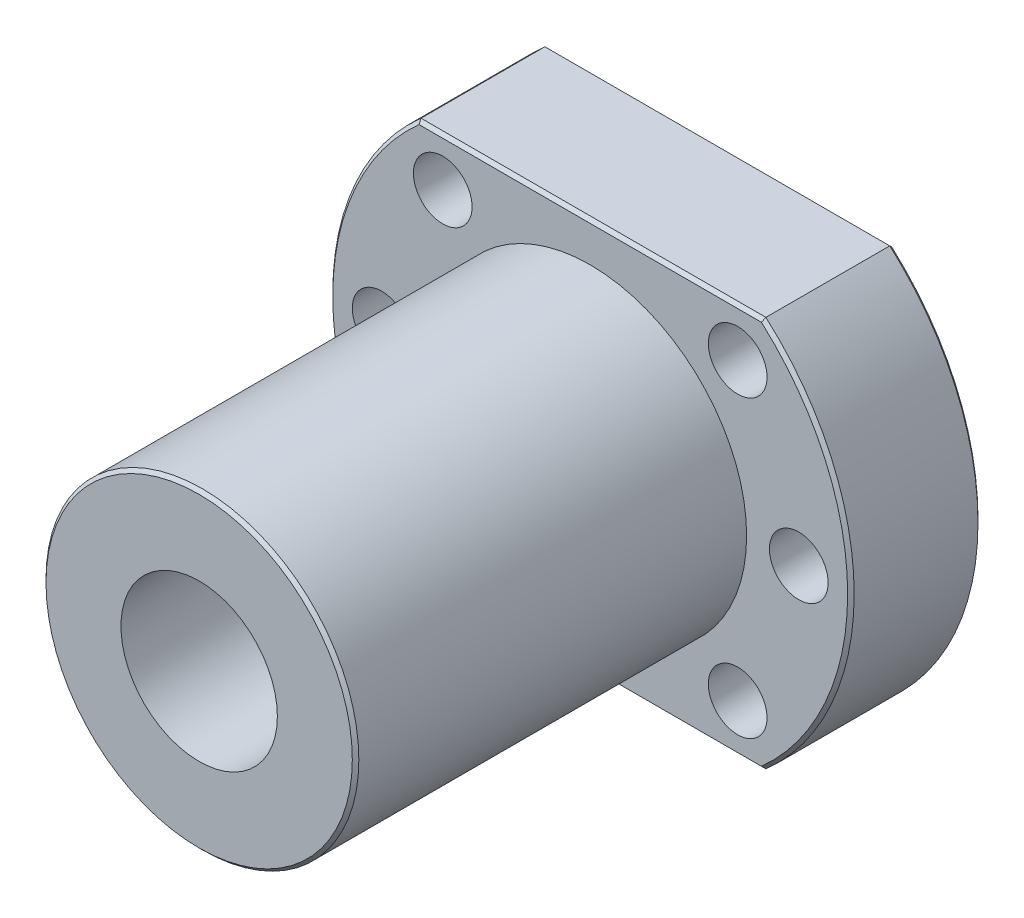
ISO-10303-21;
HEADER;
FILE_DESCRIPTION(('STEP AP214'),'2;1');
FILE_NAME('part.step','',(''),(''),'','','');
FILE_SCHEMA(('AUTOMOTIVE_DESIGN { 1 0 10303 214 1 1 1 1 }'));
ENDSEC;
DATA;
#1=APPLICATION_CONTEXT('core data for automotive mechanical design processes');
#2=APPLICATION_PROTOCOL_DEFINITION('international standard','automotive_design',2000,#1);
#3=PRODUCT_CONTEXT('',#1,'mechanical');
#4=PRODUCT('Part','Part','',(#3));
#5=PRODUCT_RELATED_PRODUCT_CATEGORY('part','',(#4));
#6=PRODUCT_DEFINITION_FORMATION('','',#4);
#7=PRODUCT_DEFINITION_CONTEXT('part definition',#1,'design');
#8=PRODUCT_DEFINITION('design','',#6,#7);
#9=PRODUCT_DEFINITION_SHAPE('','',#8);
#10=(LENGTH_UNIT() NAMED_UNIT(*) SI_UNIT(.MILLI.,.METRE.));
#11=(NAMED_UNIT(*) PLANE_ANGLE_UNIT() SI_UNIT($,.RADIAN.));
#12=(NAMED_UNIT(*) SI_UNIT($,.STERADIAN.) SOLID_ANGLE_UNIT());
#13=UNCERTAINTY_MEASURE_WITH_UNIT(LENGTH_MEASURE(1.E-05),#10,'distance_accuracy_value','');
#14=(GEOMETRIC_REPRESENTATION_CONTEXT(3) GLOBAL_UNCERTAINTY_ASSIGNED_CONTEXT((#13)) GLOBAL_UNIT_ASSIGNED_CONTEXT((#10,
#11,#12)) REPRESENTATION_CONTEXT('',''));
#15=CARTESIAN_POINT('',(0.,0.,0.));
#16=DIRECTION('',(0.,0.,1.));
#17=DIRECTION('',(1.,0.,0.));
#18=AXIS2_PLACEMENT_3D('',#15,#16,#17);
#19=CARTESIAN_POINT('',(16.,-1.1172740284298E-13,10.));
#20=DIRECTION('',(0.,0.,-1.));
#21=DIRECTION('',(-1.,0.,0.));
#22=AXIS2_PLACEMENT_3D('',#19,#20,#21);
#23=CYLINDRICAL_SURFACE('',#22,2.25);
#24=CARTESIAN_POINT('',(16.,-1.1172740284298E-13,10.));
#25=DIRECTION('',(0.,0.,1.));
#26=DIRECTION('',(1.,0.,0.));
#27=AXIS2_PLACEMENT_3D('',#24,#25,#26);
#28=CIRCLE('',#27,2.25);
#29=CARTESIAN_POINT('',(18.25,-1.1172740284298E-13,10.));
#30=VERTEX_POINT('',#29);
#31=EDGE_CURVE('E321',#30,#30,#28,.T.);
#32=ORIENTED_EDGE('',*,*,#31,.T.);
#33=EDGE_LOOP('',(#32));
#34=FACE_BOUND('',#33,.T.);
#35=CARTESIAN_POINT('',(16.,-1.1172740284298E-13,5.));
#36=DIRECTION('',(0.,0.,-1.));
#37=DIRECTION('',(-1.,0.,0.));
#38=AXIS2_PLACEMENT_3D('',#35,#36,#37);
#39=CIRCLE('',#38,2.25);
#40=CARTESIAN_POINT('',(13.75,-1.1172740284298E-13,5.));
#41=VERTEX_POINT('',#40);
#42=EDGE_CURVE('E41',#41,#41,#39,.T.);
#43=ORIENTED_EDGE('',*,*,#42,.T.);
#44=EDGE_LOOP('',(#43));
#45=FACE_BOUND('',#44,.T.);
#46=ADVANCED_FACE('F37',(#34,#45),#23,.F.);
#47=CARTESIAN_POINT('',(11.3137084989847,-11.3137084989849,10.));
#48=DIRECTION('',(0.,0.,-1.));
#49=DIRECTION('',(-1.,0.,0.));
#50=AXIS2_PLACEMENT_3D('',#47,#48,#49);
#51=CYLINDRICAL_SURFACE('',#50,2.25);
#52=CARTESIAN_POINT('',(11.3137084989847,-11.3137084989849,10.));
#53=DIRECTION('',(0.,0.,1.));
#54=DIRECTION('',(1.,0.,0.));
#55=AXIS2_PLACEMENT_3D('',#52,#53,#54);
#56=CIRCLE('',#55,2.25);
#57=CARTESIAN_POINT('',(13.5637084989847,-11.3137084989849,10.));
#58=VERTEX_POINT('',#57);
#59=EDGE_CURVE('E318',#58,#58,#56,.T.);
#60=ORIENTED_EDGE('',*,*,#59,.T.);
#61=EDGE_LOOP('',(#60));
#62=FACE_BOUND('',#61,.T.);
#63=CARTESIAN_POINT('',(11.3137084989847,-11.3137084989849,5.));
#64=DIRECTION('',(0.,0.,-1.));
#65=DIRECTION('',(-1.,0.,0.));
#66=AXIS2_PLACEMENT_3D('',#63,#64,#65);
#67=CIRCLE('',#66,2.25);
#68=CARTESIAN_POINT('',(9.06370849898466,-11.3137084989849,5.));
#69=VERTEX_POINT('',#68);
#70=EDGE_CURVE('E280',#69,#69,#67,.T.);
#71=ORIENTED_EDGE('',*,*,#70,.T.);
#72=EDGE_LOOP('',(#71));
#73=FACE_BOUND('',#72,.T.);
#74=ADVANCED_FACE('F436',(#62,#73),#51,.F.);
#75=CARTESIAN_POINT('',(-11.3137084989849,-11.3137084989846,10.));
#76=DIRECTION('',(0.,0.,-1.));
#77=DIRECTION('',(-1.,0.,0.));
#78=AXIS2_PLACEMENT_3D('',#75,#76,#77);
#79=CYLINDRICAL_SURFACE('',#78,2.25);
#80=CARTESIAN_POINT('',(-11.3137084989849,-11.3137084989846,10.));
#81=DIRECTION('',(0.,0.,1.));
#82=DIRECTION('',(1.,0.,0.));
#83=AXIS2_PLACEMENT_3D('',#80,#81,#82);
#84=CIRCLE('',#83,2.25);
#85=CARTESIAN_POINT('',(-9.0637084989849,-11.3137084989846,10.));
#86=VERTEX_POINT('',#85);
#87=EDGE_CURVE('E315',#86,#86,#84,.T.);
#88=ORIENTED_EDGE('',*,*,#87,.T.);
#89=EDGE_LOOP('',(#88));
#90=FACE_BOUND('',#89,.T.);
#91=CARTESIAN_POINT('',(-11.3137084989849,-11.3137084989846,5.));
#92=DIRECTION('',(0.,0.,-1.));
#93=DIRECTION('',(-1.,0.,0.));
#94=AXIS2_PLACEMENT_3D('',#91,#92,#93);
#95=CIRCLE('',#94,2.25);
#96=CARTESIAN_POINT('',(-13.5637084989849,-11.3137084989846,5.));
#97=VERTEX_POINT('',#96);
#98=EDGE_CURVE('E276',#97,#97,#95,.T.);
#99=ORIENTED_EDGE('',*,*,#98,.T.);
#100=EDGE_LOOP('',(#99));
#101=FACE_BOUND('',#100,.T.);
#102=ADVANCED_FACE('F443',(#90,#101),#79,.F.);
#103=CARTESIAN_POINT('',(-16.,0.,10.));
#104=DIRECTION('',(0.,0.,-1.));
#105=DIRECTION('',(-1.,0.,0.));
#106=AXIS2_PLACEMENT_3D('',#103,#104,#105);
#107=CYLINDRICAL_SURFACE('',#106,2.25);
#108=CARTESIAN_POINT('',(-16.,0.,10.));
#109=DIRECTION('',(0.,0.,1.));
#110=DIRECTION('',(1.,0.,0.));
#111=AXIS2_PLACEMENT_3D('',#108,#109,#110);
#112=CIRCLE('',#111,2.25);
#113=CARTESIAN_POINT('',(-13.75,0.,10.));
#114=VERTEX_POINT('',#113);
#115=EDGE_CURVE('E330',#114,#114,#112,.T.);
#116=ORIENTED_EDGE('',*,*,#115,.T.);
#117=EDGE_LOOP('',(#116));
#118=FACE_BOUND('',#117,.T.);
#119=CARTESIAN_POINT('',(-16.,0.,5.));
#120=DIRECTION('',(0.,0.,-1.));
#121=DIRECTION('',(-1.,0.,0.));
#122=AXIS2_PLACEMENT_3D('',#119,#120,#121);
#123=CIRCLE('',#122,2.25);
#124=CARTESIAN_POINT('',(-18.25,0.,5.));
#125=VERTEX_POINT('',#124);
#126=EDGE_CURVE('E270',#125,#125,#123,.T.);
#127=ORIENTED_EDGE('',*,*,#126,.T.);
#128=EDGE_LOOP('',(#127));
#129=FACE_BOUND('',#128,.T.);
#130=ADVANCED_FACE('F454',(#118,#129),#107,.F.);
#131=CARTESIAN_POINT('',(-11.3137084989847,11.3137084989848,10.));
#132=DIRECTION('',(0.,0.,-1.));
#133=DIRECTION('',(-1.,0.,0.));
#134=AXIS2_PLACEMENT_3D('',#131,#132,#133);
#135=CYLINDRICAL_SURFACE('',#134,2.25);
#136=CARTESIAN_POINT('',(-11.3137084989847,11.3137084989848,10.));
#137=DIRECTION('',(0.,0.,1.));
#138=DIRECTION('',(1.,0.,0.));
#139=AXIS2_PLACEMENT_3D('',#136,#137,#138);
#140=CIRCLE('',#139,2.25);
#141=CARTESIAN_POINT('',(-9.06370849898474,11.3137084989848,10.));
#142=VERTEX_POINT('',#141);
#143=EDGE_CURVE('E327',#142,#142,#140,.T.);
#144=ORIENTED_EDGE('',*,*,#143,.T.);
#145=EDGE_LOOP('',(#144));
#146=FACE_BOUND('',#145,.T.);
#147=CARTESIAN_POINT('',(-11.3137084989847,11.3137084989848,5.));
#148=DIRECTION('',(0.,0.,-1.));
#149=DIRECTION('',(-1.,0.,0.));
#150=AXIS2_PLACEMENT_3D('',#147,#148,#149);
#151=CIRCLE('',#150,2.25);
#152=CARTESIAN_POINT('',(-13.5637084989847,11.3137084989848,5.));
#153=VERTEX_POINT('',#152);
#154=EDGE_CURVE('E265',#153,#153,#151,.T.);
#155=ORIENTED_EDGE('',*,*,#154,.T.);
#156=EDGE_LOOP('',(#155));
#157=FACE_BOUND('',#156,.T.);
#158=ADVANCED_FACE('F450',(#146,#157),#135,.F.);
#159=CARTESIAN_POINT('',(11.3137084989848,11.3137084989847,10.));
#160=DIRECTION('',(0.,0.,-1.));
#161=DIRECTION('',(-1.,0.,0.));
#162=AXIS2_PLACEMENT_3D('',#159,#160,#161);
#163=CYLINDRICAL_SURFACE('',#162,2.25);
#164=CARTESIAN_POINT('',(11.3137084989848,11.3137084989847,10.));
#165=DIRECTION('',(0.,0.,1.));
#166=DIRECTION('',(1.,0.,0.));
#167=AXIS2_PLACEMENT_3D('',#164,#165,#166);
#168=CIRCLE('',#167,2.25);
#169=CARTESIAN_POINT('',(13.5637084989848,11.3137084989847,10.));
#170=VERTEX_POINT('',#169);
#171=EDGE_CURVE('E324',#170,#170,#168,.T.);
#172=ORIENTED_EDGE('',*,*,#171,.T.);
#173=EDGE_LOOP('',(#172));
#174=FACE_BOUND('',#173,.T.);
#175=CARTESIAN_POINT('',(11.3137084989848,11.3137084989847,5.));
#176=DIRECTION('',(0.,0.,-1.));
#177=DIRECTION('',(-1.,0.,0.));
#178=AXIS2_PLACEMENT_3D('',#175,#176,#177);
#179=CIRCLE('',#178,2.25);
#180=CARTESIAN_POINT('',(9.06370849898482,11.3137084989847,5.));
#181=VERTEX_POINT('',#180);
#182=EDGE_CURVE('E227',#181,#181,#179,.T.);
#183=ORIENTED_EDGE('',*,*,#182,.T.);
#184=EDGE_LOOP('',(#183));
#185=FACE_BOUND('',#184,.T.);
#186=ADVANCED_FACE('F405',(#174,#185),#163,.F.);
#187=CARTESIAN_POINT('',(0.,0.,10.));
#188=DIRECTION('',(0.,0.,1.));
#189=DIRECTION('',(1.,0.,0.));
#190=AXIS2_PLACEMENT_3D('',#187,#188,#189);
#191=PLANE('',#190);
#192=DIRECTION('',(-1.,0.,0.));
#193=VECTOR('',#192,1.);
#194=CARTESIAN_POINT('',(-13.228756555323,14.75,10.));
#195=LINE('',#194,#193);
#196=CARTESIAN_POINT('',(13.1339255365637,14.75,10.));
#197=VERTEX_POINT('',#196);
#198=CARTESIAN_POINT('',(-13.1339255365637,14.75,10.));
#199=VERTEX_POINT('',#198);
#200=EDGE_CURVE('E157',#197,#199,#195,.T.);
#201=ORIENTED_EDGE('',*,*,#200,.T.);
#202=CARTESIAN_POINT('',(0.,0.,10.));
#203=DIRECTION('',(0.,0.,1.));
#204=DIRECTION('',(1.,0.,0.));
#205=AXIS2_PLACEMENT_3D('',#202,#203,#204);
#206=CIRCLE('',#205,19.75);
#207=CARTESIAN_POINT('',(-13.1339255365637,-14.75,10.));
#208=VERTEX_POINT('',#207);
#209=EDGE_CURVE('E163',#199,#208,#206,.T.);
#210=ORIENTED_EDGE('',*,*,#209,.T.);
#211=DIRECTION('',(1.,0.,0.));
#212=VECTOR('',#211,1.);
#213=CARTESIAN_POINT('',(13.228756555323,-14.75,10.));
#214=LINE('',#213,#212);
#215=CARTESIAN_POINT('',(13.1339255365637,-14.75,10.));
#216=VERTEX_POINT('',#215);
#217=EDGE_CURVE('E161',#208,#216,#214,.T.);
#218=ORIENTED_EDGE('',*,*,#217,.T.);
#219=CARTESIAN_POINT('',(0.,0.,10.));
#220=DIRECTION('',(0.,0.,1.));
#221=DIRECTION('',(1.,0.,0.));
#222=AXIS2_PLACEMENT_3D('',#219,#220,#221);
#223=CIRCLE('',#222,19.75);
#224=EDGE_CURVE('E159',#216,#197,#223,.T.);
#225=ORIENTED_EDGE('',*,*,#224,.T.);
#226=EDGE_LOOP('',(#201,#210,#218,#225));
#227=FACE_BOUND('',#226,.T.);
#228=ORIENTED_EDGE('',*,*,#87,.F.);
#229=EDGE_LOOP('',(#228));
#230=FACE_BOUND('',#229,.T.);
#231=ORIENTED_EDGE('',*,*,#31,.F.);
#232=EDGE_LOOP('',(#231));
#233=FACE_BOUND('',#232,.T.);
#234=ORIENTED_EDGE('',*,*,#143,.F.);
#235=EDGE_LOOP('',(#234));
#236=FACE_BOUND('',#235,.T.);
#237=ORIENTED_EDGE('',*,*,#115,.F.);
#238=EDGE_LOOP('',(#237));
#239=FACE_BOUND('',#238,.T.);
#240=ORIENTED_EDGE('',*,*,#171,.F.);
#241=EDGE_LOOP('',(#240));
#242=FACE_BOUND('',#241,.T.);
#243=ORIENTED_EDGE('',*,*,#59,.F.);
#244=EDGE_LOOP('',(#243));
#245=FACE_BOUND('',#244,.T.);
#246=CARTESIAN_POINT('',(0.,0.,10.));
#247=DIRECTION('',(0.,0.,1.));
#248=DIRECTION('',(1.,0.,0.));
#249=AXIS2_PLACEMENT_3D('',#246,#247,#248);
#250=CIRCLE('',#249,12.);
#251=CARTESIAN_POINT('',(12.,0.,10.));
#252=VERTEX_POINT('',#251);
#253=EDGE_CURVE('E310',#252,#252,#250,.T.);
#254=ORIENTED_EDGE('',*,*,#253,.F.);
#255=EDGE_LOOP('',(#254));
#256=FACE_BOUND('',#255,.T.);
#257=ADVANCED_FACE('F402',(#227,#230,#233,#236,#239,#242,#245,#256),#191,.T.);
#258=CARTESIAN_POINT('',(0.,0.,0.));
#259=DIRECTION('',(0.,0.,1.));
#260=DIRECTION('',(1.,0.,0.));
#261=AXIS2_PLACEMENT_3D('',#258,#259,#260);
#262=PLANE('',#261);
#263=CARTESIAN_POINT('',(15.999999999999,-4.86037287389179E-13,0.));
#264=DIRECTION('',(0.,0.,-1.));
#265=DIRECTION('',(-1.,0.,0.));
#266=AXIS2_PLACEMENT_3D('',#263,#264,#265);
#267=CIRCLE('',#266,3.5);
#268=CARTESIAN_POINT('',(12.499999999999,-4.86037287389179E-13,0.));
#269=VERTEX_POINT('',#268);
#270=EDGE_CURVE('E291',#269,#269,#267,.T.);
#271=ORIENTED_EDGE('',*,*,#270,.F.);
#272=EDGE_LOOP('',(#271));
#273=FACE_BOUND('',#272,.T.);
#274=CARTESIAN_POINT('',(-16.000000000001,2.40984562224746E-12,0.));
#275=DIRECTION('',(0.,0.,-1.));
#276=DIRECTION('',(-1.,0.,0.));
#277=AXIS2_PLACEMENT_3D('',#274,#275,#276);
#278=CIRCLE('',#277,3.5);
#279=CARTESIAN_POINT('',(-19.500000000001,2.40984562224746E-12,0.));
#280=VERTEX_POINT('',#279);
#281=EDGE_CURVE('E278',#280,#280,#278,.T.);
#282=ORIENTED_EDGE('',*,*,#281,.F.);
#283=EDGE_LOOP('',(#282));
#284=FACE_BOUND('',#283,.T.);
#285=DIRECTION('',(-1.,0.,0.));
#286=VECTOR('',#285,1.);
#287=CARTESIAN_POINT('',(0.,-14.75,0.));
#288=LINE('',#287,#286);
#289=CARTESIAN_POINT('',(13.1339255365637,-14.75,0.));
#290=VERTEX_POINT('',#289);
#291=CARTESIAN_POINT('',(11.978464634758,-14.75,0.));
#292=VERTEX_POINT('',#291);
#293=EDGE_CURVE('E132',#290,#292,#288,.T.);
#294=ORIENTED_EDGE('',*,*,#293,.T.);
#295=CARTESIAN_POINT('',(11.3137084989828,-11.3137084989848,0.));
#296=DIRECTION('',(0.,0.,-1.));
#297=DIRECTION('',(-1.,0.,0.));
#298=AXIS2_PLACEMENT_3D('',#295,#296,#297);
#299=CIRCLE('',#298,3.5);
#300=CARTESIAN_POINT('',(10.6489523632075,-14.75,0.));
#301=VERTEX_POINT('',#300);
#302=EDGE_CURVE('E52',#301,#292,#299,.T.);
#303=ORIENTED_EDGE('',*,*,#302,.F.);
#304=CARTESIAN_POINT('',(-10.6489523632221,-14.75,0.));
#305=VERTEX_POINT('',#304);
#306=EDGE_CURVE('E59',#301,#305,#288,.T.);
#307=ORIENTED_EDGE('',*,*,#306,.T.);
#308=CARTESIAN_POINT('',(-11.3137084989867,-11.3137084989828,0.));
#309=DIRECTION('',(0.,0.,-1.));
#310=DIRECTION('',(-1.,0.,0.));
#311=AXIS2_PLACEMENT_3D('',#308,#309,#310);
#312=CIRCLE('',#311,3.5);
#313=CARTESIAN_POINT('',(-11.9784646347514,-14.75,0.));
#314=VERTEX_POINT('',#313);
#315=EDGE_CURVE('E282',#314,#305,#312,.T.);
#316=ORIENTED_EDGE('',*,*,#315,.F.);
#317=CARTESIAN_POINT('',(-13.1339255365637,-14.75,0.));
#318=VERTEX_POINT('',#317);
#319=EDGE_CURVE('E138',#314,#318,#288,.T.);
#320=ORIENTED_EDGE('',*,*,#319,.T.);
#321=CARTESIAN_POINT('',(0.,0.,0.));
#322=DIRECTION('',(0.,0.,1.));
#323=DIRECTION('',(1.,0.,0.));
#324=AXIS2_PLACEMENT_3D('',#321,#322,#323);
#325=CIRCLE('',#324,19.75);
#326=CARTESIAN_POINT('',(-13.1339255365637,14.75,0.));
#327=VERTEX_POINT('',#326);
#328=EDGE_CURVE('E141',#318,#327,#325,.F.);
#329=ORIENTED_EDGE('',*,*,#328,.T.);
#330=DIRECTION('',(1.,0.,0.));
#331=VECTOR('',#330,1.);
#332=CARTESIAN_POINT('',(0.,14.75,0.));
#333=LINE('',#332,#331);
#334=CARTESIAN_POINT('',(-11.9784646347699,14.75,0.));
#335=VERTEX_POINT('',#334);
#336=EDGE_CURVE('E351',#327,#335,#333,.T.);
#337=ORIENTED_EDGE('',*,*,#336,.T.);
#338=CARTESIAN_POINT('',(-11.3137084989847,11.3137084989867,0.));
#339=DIRECTION('',(0.,0.,-1.));
#340=DIRECTION('',(-1.,0.,0.));
#341=AXIS2_PLACEMENT_3D('',#338,#339,#340);
#342=CIRCLE('',#341,3.5);
#343=CARTESIAN_POINT('',(-10.6489523631995,14.75,0.));
#344=VERTEX_POINT('',#343);
#345=EDGE_CURVE('E273',#344,#335,#342,.T.);
#346=ORIENTED_EDGE('',*,*,#345,.F.);
#347=CARTESIAN_POINT('',(10.6489523632102,14.75,0.));
#348=VERTEX_POINT('',#347);
#349=EDGE_CURVE('E354',#344,#348,#333,.T.);
#350=ORIENTED_EDGE('',*,*,#349,.T.);
#351=CARTESIAN_POINT('',(11.3137084989848,11.3137084989847,0.));
#352=DIRECTION('',(0.,0.,-1.));
#353=DIRECTION('',(-1.,0.,0.));
#354=AXIS2_PLACEMENT_3D('',#351,#352,#353);
#355=CIRCLE('',#354,3.5);
#356=CARTESIAN_POINT('',(11.9784646347595,14.75,0.));
#357=VERTEX_POINT('',#356);
#358=EDGE_CURVE('E268',#357,#348,#355,.T.);
#359=ORIENTED_EDGE('',*,*,#358,.F.);
#360=CARTESIAN_POINT('',(13.1339255365637,14.75,0.));
#361=VERTEX_POINT('',#360);
#362=EDGE_CURVE('E350',#357,#361,#333,.T.);
#363=ORIENTED_EDGE('',*,*,#362,.T.);
#364=CARTESIAN_POINT('',(0.,0.,0.));
#365=DIRECTION('',(0.,0.,1.));
#366=DIRECTION('',(1.,0.,0.));
#367=AXIS2_PLACEMENT_3D('',#364,#365,#366);
#368=CIRCLE('',#367,19.75);
#369=EDGE_CURVE('E353',#361,#290,#368,.F.);
#370=ORIENTED_EDGE('',*,*,#369,.T.);
#371=EDGE_LOOP('',(#294,#303,#307,#316,#320,#329,#337,#346,#350,#359,#363,#370));
#372=FACE_BOUND('',#371,.T.);
#373=CARTESIAN_POINT('',(0.,0.,0.));
#374=DIRECTION('',(0.,0.,1.));
#375=DIRECTION('',(1.,0.,0.));
#376=AXIS2_PLACEMENT_3D('',#373,#374,#375);
#377=CIRCLE('',#376,6.);
#378=CARTESIAN_POINT('',(6.,0.,0.));
#379=VERTEX_POINT('',#378);
#380=EDGE_CURVE('E307',#379,#379,#377,.T.);
#381=ORIENTED_EDGE('',*,*,#380,.T.);
#382=EDGE_LOOP('',(#381));
#383=FACE_BOUND('',#382,.T.);
#384=ADVANCED_FACE('F130',(#273,#284,#372,#383),#262,.F.);
#385=CARTESIAN_POINT('',(0.,0.,10.));
#386=DIRECTION('',(0.,0.,-1.));
#387=DIRECTION('',(-1.,0.,0.));
#388=AXIS2_PLACEMENT_3D('',#385,#386,#387);
#389=CYLINDRICAL_SURFACE('',#388,20.);
#390=DIRECTION('',(0.,0.,-1.));
#391=VECTOR('',#390,1.);
#392=CARTESIAN_POINT('',(-13.228756555323,15.,10.));
#393=LINE('',#392,#391);
#394=CARTESIAN_POINT('',(-13.228756555323,15.,9.75));
#395=VERTEX_POINT('',#394);
#396=CARTESIAN_POINT('',(-13.228756555323,15.,0.249999999999993));
#397=VERTEX_POINT('',#396);
#398=EDGE_CURVE('E333',#395,#397,#393,.T.);
#399=ORIENTED_EDGE('',*,*,#398,.T.);
#400=CARTESIAN_POINT('',(0.,0.,0.249999999999993));
#401=DIRECTION('',(0.,0.,1.));
#402=DIRECTION('',(1.,0.,0.));
#403=AXIS2_PLACEMENT_3D('',#400,#401,#402);
#404=CIRCLE('',#403,20.);
#405=CARTESIAN_POINT('',(-13.228756555323,-15.,0.249999999999993));
#406=VERTEX_POINT('',#405);
#407=EDGE_CURVE('E147',#397,#406,#404,.T.);
#408=ORIENTED_EDGE('',*,*,#407,.T.);
#409=DIRECTION('',(0.,0.,-1.));
#410=VECTOR('',#409,1.);
#411=CARTESIAN_POINT('',(-13.228756555323,-15.,10.));
#412=LINE('',#411,#410);
#413=CARTESIAN_POINT('',(-13.228756555323,-15.,9.75));
#414=VERTEX_POINT('',#413);
#415=EDGE_CURVE('E342',#414,#406,#412,.T.);
#416=ORIENTED_EDGE('',*,*,#415,.F.);
#417=CARTESIAN_POINT('',(0.,0.,9.75));
#418=DIRECTION('',(0.,0.,1.));
#419=DIRECTION('',(1.,0.,0.));
#420=AXIS2_PLACEMENT_3D('',#417,#418,#419);
#421=CIRCLE('',#420,20.);
#422=EDGE_CURVE('E140',#414,#395,#421,.F.);
#423=ORIENTED_EDGE('',*,*,#422,.T.);
#424=EDGE_LOOP('',(#399,#408,#416,#423));
#425=FACE_BOUND('',#424,.T.);
#426=ADVANCED_FACE('F370',(#425),#389,.T.);
#427=CARTESIAN_POINT('',(-13.228756555323,-15.,10.));
#428=DIRECTION('',(0.,1.,0.));
#429=DIRECTION('',(0.,0.,1.));
#430=AXIS2_PLACEMENT_3D('',#427,#428,#429);
#431=PLANE('',#430);
#432=ORIENTED_EDGE('',*,*,#415,.T.);
#433=DIRECTION('',(1.,0.,0.));
#434=VECTOR('',#433,1.);
#435=CARTESIAN_POINT('',(-13.228756555323,-15.,0.249999999999993));
#436=LINE('',#435,#434);
#437=CARTESIAN_POINT('',(13.228756555323,-15.,0.249999999999993));
#438=VERTEX_POINT('',#437);
#439=EDGE_CURVE('E347',#406,#438,#436,.T.);
#440=ORIENTED_EDGE('',*,*,#439,.T.);
#441=DIRECTION('',(0.,0.,-1.));
#442=VECTOR('',#441,1.);
#443=CARTESIAN_POINT('',(13.228756555323,-15.,10.));
#444=LINE('',#443,#442);
#445=CARTESIAN_POINT('',(13.228756555323,-15.,9.75));
#446=VERTEX_POINT('',#445);
#447=EDGE_CURVE('E339',#446,#438,#444,.T.);
#448=ORIENTED_EDGE('',*,*,#447,.F.);
#449=DIRECTION('',(-1.,0.,0.));
#450=VECTOR('',#449,1.);
#451=CARTESIAN_POINT('',(-13.228756555323,-15.,9.75));
#452=LINE('',#451,#450);
#453=EDGE_CURVE('E345',#446,#414,#452,.T.);
#454=ORIENTED_EDGE('',*,*,#453,.T.);
#455=EDGE_LOOP('',(#432,#440,#448,#454));
#456=FACE_BOUND('',#455,.T.);
#457=ADVANCED_FACE('F374',(#456),#431,.F.);
#458=CARTESIAN_POINT('',(0.,0.,10.));
#459=DIRECTION('',(0.,0.,-1.));
#460=DIRECTION('',(-1.,0.,0.));
#461=AXIS2_PLACEMENT_3D('',#458,#459,#460);
#462=CYLINDRICAL_SURFACE('',#461,20.);
#463=ORIENTED_EDGE('',*,*,#447,.T.);
#464=CARTESIAN_POINT('',(0.,0.,0.249999999999993));
#465=DIRECTION('',(0.,0.,1.));
#466=DIRECTION('',(1.,0.,0.));
#467=AXIS2_PLACEMENT_3D('',#464,#465,#466);
#468=CIRCLE('',#467,20.);
#469=CARTESIAN_POINT('',(13.228756555323,15.,0.249999999999993));
#470=VERTEX_POINT('',#469);
#471=EDGE_CURVE('E151',#438,#470,#468,.T.);
#472=ORIENTED_EDGE('',*,*,#471,.T.);
#473=DIRECTION('',(0.,0.,-1.));
#474=VECTOR('',#473,1.);
#475=CARTESIAN_POINT('',(13.228756555323,15.,10.));
#476=LINE('',#475,#474);
#477=CARTESIAN_POINT('',(13.228756555323,15.,9.75));
#478=VERTEX_POINT('',#477);
#479=EDGE_CURVE('E336',#478,#470,#476,.T.);
#480=ORIENTED_EDGE('',*,*,#479,.F.);
#481=CARTESIAN_POINT('',(0.,0.,9.75));
#482=DIRECTION('',(0.,0.,1.));
#483=DIRECTION('',(1.,0.,0.));
#484=AXIS2_PLACEMENT_3D('',#481,#482,#483);
#485=CIRCLE('',#484,20.);
#486=EDGE_CURVE('E149',#478,#446,#485,.F.);
#487=ORIENTED_EDGE('',*,*,#486,.T.);
#488=EDGE_LOOP('',(#463,#472,#480,#487));
#489=FACE_BOUND('',#488,.T.);
#490=ADVANCED_FACE('F395',(#489),#462,.T.);
#491=CARTESIAN_POINT('',(-13.228756555323,15.,10.));
#492=DIRECTION('',(0.,-1.,0.));
#493=DIRECTION('',(0.,0.,-1.));
#494=AXIS2_PLACEMENT_3D('',#491,#492,#493);
#495=PLANE('',#494);
#496=ORIENTED_EDGE('',*,*,#479,.T.);
#497=DIRECTION('',(-1.,0.,0.));
#498=VECTOR('',#497,1.);
#499=CARTESIAN_POINT('',(-13.228756555323,15.,0.249999999999993));
#500=LINE('',#499,#498);
#501=EDGE_CURVE('E155',#470,#397,#500,.T.);
#502=ORIENTED_EDGE('',*,*,#501,.T.);
#503=ORIENTED_EDGE('',*,*,#398,.F.);
#504=DIRECTION('',(1.,0.,0.));
#505=VECTOR('',#504,1.);
#506=CARTESIAN_POINT('',(13.228756555323,15.,9.75));
#507=LINE('',#506,#505);
#508=EDGE_CURVE('E153',#395,#478,#507,.T.);
#509=ORIENTED_EDGE('',*,*,#508,.T.);
#510=EDGE_LOOP('',(#496,#502,#503,#509));
#511=FACE_BOUND('',#510,.T.);
#512=ADVANCED_FACE('F386',(#511),#495,.F.);
#513=CARTESIAN_POINT('',(0.,0.,40.));
#514=DIRECTION('',(0.,0.,-1.));
#515=DIRECTION('',(-1.,0.,0.));
#516=AXIS2_PLACEMENT_3D('',#513,#514,#515);
#517=CYLINDRICAL_SURFACE('',#516,12.);
#518=CARTESIAN_POINT('',(0.,0.,39.75));
#519=DIRECTION('',(0.,0.,1.));
#520=DIRECTION('',(1.,0.,0.));
#521=AXIS2_PLACEMENT_3D('',#518,#519,#520);
#522=CIRCLE('',#521,12.);
#523=CARTESIAN_POINT('',(12.,0.,39.75));
#524=VERTEX_POINT('',#523);
#525=EDGE_CURVE('E169',#524,#524,#522,.F.);
#526=ORIENTED_EDGE('',*,*,#525,.T.);
#527=EDGE_LOOP('',(#526));
#528=FACE_BOUND('',#527,.T.);
#529=ORIENTED_EDGE('',*,*,#253,.T.);
#530=EDGE_LOOP('',(#529));
#531=FACE_BOUND('',#530,.T.);
#532=ADVANCED_FACE('F421',(#528,#531),#517,.T.);
#533=CARTESIAN_POINT('',(0.,0.,40.));
#534=DIRECTION('',(0.,0.,1.));
#535=DIRECTION('',(1.,0.,0.));
#536=AXIS2_PLACEMENT_3D('',#533,#534,#535);
#537=PLANE('',#536);
#538=CARTESIAN_POINT('',(0.,0.,40.));
#539=DIRECTION('',(0.,0.,1.));
#540=DIRECTION('',(1.,0.,0.));
#541=AXIS2_PLACEMENT_3D('',#538,#539,#540);
#542=CIRCLE('',#541,11.75);
#543=CARTESIAN_POINT('',(11.75,0.,40.));
#544=VERTEX_POINT('',#543);
#545=EDGE_CURVE('E166',#544,#544,#542,.T.);
#546=ORIENTED_EDGE('',*,*,#545,.T.);
#547=EDGE_LOOP('',(#546));
#548=FACE_BOUND('',#547,.T.);
#549=CARTESIAN_POINT('',(0.,0.,40.));
#550=DIRECTION('',(0.,0.,1.));
#551=DIRECTION('',(1.,0.,0.));
#552=AXIS2_PLACEMENT_3D('',#549,#550,#551);
#553=CIRCLE('',#552,6.);
#554=CARTESIAN_POINT('',(6.,0.,40.));
#555=VERTEX_POINT('',#554);
#556=EDGE_CURVE('E213',#555,#555,#553,.T.);
#557=ORIENTED_EDGE('',*,*,#556,.F.);
#558=EDGE_LOOP('',(#557));
#559=FACE_BOUND('',#558,.T.);
#560=ADVANCED_FACE('F423',(#548,#559),#537,.T.);
#561=CARTESIAN_POINT('',(0.,0.,0.));
#562=DIRECTION('',(0.,0.,1.));
#563=DIRECTION('',(1.,0.,0.));
#564=AXIS2_PLACEMENT_3D('',#561,#562,#563);
#565=CYLINDRICAL_SURFACE('',#564,6.);
#566=ORIENTED_EDGE('',*,*,#380,.F.);
#567=EDGE_LOOP('',(#566));
#568=FACE_BOUND('',#567,.T.);
#569=ORIENTED_EDGE('',*,*,#556,.T.);
#570=EDGE_LOOP('',(#569));
#571=FACE_BOUND('',#570,.T.);
#572=ADVANCED_FACE('F430',(#568,#571),#565,.F.);
#573=CARTESIAN_POINT('',(-13.228756555323,15.,0.249999999999993));
#574=DIRECTION('',(0.,-0.707106781186538,0.707106781186557));
#575=DIRECTION('',(-1.,0.,0.));
#576=AXIS2_PLACEMENT_3D('',#573,#574,#575);
#577=PLANE('',#576);
#578=CARTESIAN_POINT('',(-11.3137084989847,11.3137084989867,-3.43629150101316));
#579=DIRECTION('',(0.,-0.707106781186538,0.707106781186557));
#580=DIRECTION('',(0.,-0.707106781186557,-0.707106781186538));
#581=AXIS2_PLACEMENT_3D('',#578,#579,#580);
#582=ELLIPSE('',#581,4.94974746830576,3.5);
#583=EDGE_CURVE('E260',#335,#344,#582,.F.);
#584=ORIENTED_EDGE('',*,*,#583,.F.);
#585=ORIENTED_EDGE('',*,*,#336,.F.);
#586=CARTESIAN_POINT('',(-13.1339255365637,14.75,0.));
#587=CARTESIAN_POINT('',(-13.1497837444647,14.791656607408,0.0416566074079784));
#588=CARTESIAN_POINT('',(-13.1656154333218,14.8333182444718,0.083318244471845));
#589=CARTESIAN_POINT('',(-13.1972257729081,14.9166515778052,0.166651577805202));
#590=CARTESIAN_POINT('',(-13.2130044236374,14.9583232740747,0.208323274074666));
#591=CARTESIAN_POINT('',(-13.228756555323,15.,0.249999999999994));
#592=B_SPLINE_CURVE_WITH_KNOTS('',3,(#586,#587,#588,#589,#590,#591),.UNSPECIFIED.,.F.,.F.,(4,2,
4),(0.,0.183025237056976,0.366050473647664),.UNSPECIFIED.);
#593=EDGE_CURVE('E206',#397,#327,#592,.F.);
#594=ORIENTED_EDGE('',*,*,#593,.F.);
#595=ORIENTED_EDGE('',*,*,#501,.F.);
#596=CARTESIAN_POINT('',(13.228756555323,15.,0.249999999999993));
#597=CARTESIAN_POINT('',(13.2130044236374,14.9583232740747,0.208323274074666));
#598=CARTESIAN_POINT('',(13.1972257729081,14.9166515778052,0.166651577805201));
#599=CARTESIAN_POINT('',(13.1656154333218,14.8333182444718,0.0833182444718446));
#600=CARTESIAN_POINT('',(13.1497837444647,14.791656607408,0.0416566074079786));
#601=CARTESIAN_POINT('',(13.1339255365637,14.75,0.));
#602=B_SPLINE_CURVE_WITH_KNOTS('',3,(#596,#597,#598,#599,#600,#601),.UNSPECIFIED.,.F.,.F.,(4,2,
4),(0.,0.183025236590689,0.366050473647663),.UNSPECIFIED.);
#603=EDGE_CURVE('E214',#361,#470,#602,.F.);
#604=ORIENTED_EDGE('',*,*,#603,.F.);
#605=ORIENTED_EDGE('',*,*,#362,.F.);
#606=CARTESIAN_POINT('',(11.3137084989848,11.3137084989847,-3.4362915010152));
#607=DIRECTION('',(0.,-0.707106781186538,0.707106781186557));
#608=DIRECTION('',(0.,-0.707106781186557,-0.707106781186538));
#609=AXIS2_PLACEMENT_3D('',#606,#607,#608);
#610=ELLIPSE('',#609,4.94974746830576,3.5);
#611=EDGE_CURVE('E172',#348,#357,#610,.F.);
#612=ORIENTED_EDGE('',*,*,#611,.F.);
#613=ORIENTED_EDGE('',*,*,#349,.F.);
#614=EDGE_LOOP('',(#584,#585,#594,#595,#604,#605,#612,#613));
#615=FACE_BOUND('',#614,.T.);
#616=ADVANCED_FACE('F200',(#615),#577,.F.);
#617=CARTESIAN_POINT('',(0.,0.,0.249999999999993));
#618=DIRECTION('',(0.,0.,1.));
#619=DIRECTION('',(1.,0.,0.));
#620=AXIS2_PLACEMENT_3D('',#617,#618,#619);
#621=CONICAL_SURFACE('',#620,20.,0.785398163397462);
#622=ORIENTED_EDGE('',*,*,#593,.T.);
#623=ORIENTED_EDGE('',*,*,#328,.F.);
#624=CARTESIAN_POINT('',(-13.1339255365637,-14.75,0.));
#625=CARTESIAN_POINT('',(-13.1497837444647,-14.791656607408,0.0416566074079784));
#626=CARTESIAN_POINT('',(-13.1656154333218,-14.8333182444718,0.083318244471845));
#627=CARTESIAN_POINT('',(-13.1972257729081,-14.9166515778052,0.166651577805202));
#628=CARTESIAN_POINT('',(-13.2130044236374,-14.9583232740747,0.208323274074666));
#629=CARTESIAN_POINT('',(-13.228756555323,-15.,0.249999999999994));
#630=B_SPLINE_CURVE_WITH_KNOTS('',3,(#624,#625,#626,#627,#628,#629),.UNSPECIFIED.,.F.,.F.,(4,2,
4),(0.,0.183025237056976,0.366050473647664),.UNSPECIFIED.);
#631=EDGE_CURVE('E181',#406,#318,#630,.F.);
#632=ORIENTED_EDGE('',*,*,#631,.F.);
#633=ORIENTED_EDGE('',*,*,#407,.F.);
#634=EDGE_LOOP('',(#622,#623,#632,#633));
#635=FACE_BOUND('',#634,.T.);
#636=ADVANCED_FACE('F195',(#635),#621,.T.);
#637=CARTESIAN_POINT('',(0.,0.,0.249999999999993));
#638=DIRECTION('',(0.,0.,1.));
#639=DIRECTION('',(1.,0.,0.));
#640=AXIS2_PLACEMENT_3D('',#637,#638,#639);
#641=CONICAL_SURFACE('',#640,20.,0.785398163397462);
#642=ORIENTED_EDGE('',*,*,#603,.T.);
#643=ORIENTED_EDGE('',*,*,#471,.F.);
#644=CARTESIAN_POINT('',(13.228756555323,-15.,0.249999999999993));
#645=CARTESIAN_POINT('',(13.2130044236374,-14.9583232740747,0.208323274074665));
#646=CARTESIAN_POINT('',(13.1972257729081,-14.9166515778052,0.1666515778052));
#647=CARTESIAN_POINT('',(13.1656154333218,-14.8333182444718,0.0833182444718432));
#648=CARTESIAN_POINT('',(13.1497837444647,-14.791656607408,0.0416566074079767));
#649=CARTESIAN_POINT('',(13.1339255365637,-14.75,0.));
#650=B_SPLINE_CURVE_WITH_KNOTS('',3,(#644,#645,#646,#647,#648,#649),.UNSPECIFIED.,.F.,.F.,(4,2,
4),(0.,0.183025236590689,0.366050473647665),.UNSPECIFIED.);
#651=EDGE_CURVE('E173',#290,#438,#650,.F.);
#652=ORIENTED_EDGE('',*,*,#651,.F.);
#653=ORIENTED_EDGE('',*,*,#369,.F.);
#654=EDGE_LOOP('',(#642,#643,#652,#653));
#655=FACE_BOUND('',#654,.T.);
#656=ADVANCED_FACE('F189',(#655),#641,.T.);
#657=CARTESIAN_POINT('',(-13.228756555323,-15.,0.249999999999993));
#658=DIRECTION('',(0.,0.707106781186538,0.707106781186557));
#659=DIRECTION('',(1.,0.,0.));
#660=AXIS2_PLACEMENT_3D('',#657,#658,#659);
#661=PLANE('',#660);
#662=CARTESIAN_POINT('',(11.3137084989828,-11.3137084989848,-3.43629150101508));
#663=DIRECTION('',(0.,0.707106781186538,0.707106781186557));
#664=DIRECTION('',(0.,0.707106781186557,-0.707106781186538));
#665=AXIS2_PLACEMENT_3D('',#662,#663,#664);
#666=ELLIPSE('',#665,4.94974746830576,3.5);
#667=EDGE_CURVE('E11',#292,#301,#666,.F.);
#668=ORIENTED_EDGE('',*,*,#667,.F.);
#669=ORIENTED_EDGE('',*,*,#293,.F.);
#670=ORIENTED_EDGE('',*,*,#651,.T.);
#671=ORIENTED_EDGE('',*,*,#439,.F.);
#672=ORIENTED_EDGE('',*,*,#631,.T.);
#673=ORIENTED_EDGE('',*,*,#319,.F.);
#674=CARTESIAN_POINT('',(-11.3137084989867,-11.3137084989828,-3.43629150101713));
#675=DIRECTION('',(0.,0.707106781186538,0.707106781186557));
#676=DIRECTION('',(0.,0.707106781186557,-0.707106781186538));
#677=AXIS2_PLACEMENT_3D('',#674,#675,#676);
#678=ELLIPSE('',#677,4.94974746830576,3.5);
#679=EDGE_CURVE('E46',#305,#314,#678,.F.);
#680=ORIENTED_EDGE('',*,*,#679,.F.);
#681=ORIENTED_EDGE('',*,*,#306,.F.);
#682=EDGE_LOOP('',(#668,#669,#670,#671,#672,#673,#680,#681));
#683=FACE_BOUND('',#682,.T.);
#684=ADVANCED_FACE('F136',(#683),#661,.F.);
#685=CARTESIAN_POINT('',(0.,0.,10.));
#686=DIRECTION('',(0.,0.,-1.));
#687=DIRECTION('',(-1.,0.,0.));
#688=AXIS2_PLACEMENT_3D('',#685,#686,#687);
#689=CONICAL_SURFACE('',#688,19.75,0.785398163397448);
#690=CARTESIAN_POINT('',(13.1339255365637,-14.75,10.));
#691=CARTESIAN_POINT('',(13.1497837444647,-14.791656607408,9.95834339259202));
#692=CARTESIAN_POINT('',(13.1656154333218,-14.8333182444718,9.91668175552815));
#693=CARTESIAN_POINT('',(13.1972257729081,-14.9166515778052,9.83334842219479));
#694=CARTESIAN_POINT('',(13.2130044236374,-14.9583232740747,9.79167672592533));
#695=CARTESIAN_POINT('',(13.228756555323,-15.,9.75));
#696=B_SPLINE_CURVE_WITH_KNOTS('',3,(#690,#691,#692,#693,#694,#695),.UNSPECIFIED.,.F.,.F.,(4,2,
4),(0.,0.183025237056979,0.366050473647669),.UNSPECIFIED.);
#697=EDGE_CURVE('E254',#446,#216,#696,.F.);
#698=ORIENTED_EDGE('',*,*,#697,.F.);
#699=ORIENTED_EDGE('',*,*,#486,.F.);
#700=CARTESIAN_POINT('',(13.1339255365637,14.75,10.));
#701=CARTESIAN_POINT('',(13.1497837444647,14.791656607408,9.95834339259202));
#702=CARTESIAN_POINT('',(13.1656154333218,14.8333182444718,9.91668175552815));
#703=CARTESIAN_POINT('',(13.1972257729081,14.9166515778052,9.83334842219479));
#704=CARTESIAN_POINT('',(13.2130044236374,14.9583232740747,9.79167672592533));
#705=CARTESIAN_POINT('',(13.228756555323,15.,9.75));
#706=B_SPLINE_CURVE_WITH_KNOTS('',3,(#700,#701,#702,#703,#704,#705),.UNSPECIFIED.,.F.,.F.,(4,2,
4),(0.,0.183025237056978,0.366050473647669),.UNSPECIFIED.);
#707=EDGE_CURVE('E182',#197,#478,#706,.T.);
#708=ORIENTED_EDGE('',*,*,#707,.F.);
#709=ORIENTED_EDGE('',*,*,#224,.F.);
#710=EDGE_LOOP('',(#698,#699,#708,#709));
#711=FACE_BOUND('',#710,.T.);
#712=ADVANCED_FACE('F194',(#711),#689,.T.);
#713=CARTESIAN_POINT('',(0.,14.75,10.));
#714=DIRECTION('',(0.,0.707106781186547,0.707106781186547));
#715=DIRECTION('',(1.,0.,0.));
#716=AXIS2_PLACEMENT_3D('',#713,#714,#715);
#717=PLANE('',#716);
#718=ORIENTED_EDGE('',*,*,#707,.T.);
#719=ORIENTED_EDGE('',*,*,#508,.F.);
#720=CARTESIAN_POINT('',(-13.228756555323,15.,9.75));
#721=CARTESIAN_POINT('',(-13.2130044236374,14.9583232740747,9.79167672592533));
#722=CARTESIAN_POINT('',(-13.1972257729081,14.9166515778052,9.83334842219479));
#723=CARTESIAN_POINT('',(-13.1656154333218,14.8333182444718,9.91668175552815));
#724=CARTESIAN_POINT('',(-13.1497837444647,14.791656607408,9.95834339259202));
#725=CARTESIAN_POINT('',(-13.1339255365637,14.75,10.));
#726=B_SPLINE_CURVE_WITH_KNOTS('',3,(#720,#721,#722,#723,#724,#725),.UNSPECIFIED.,.F.,.F.,(4,2,
4),(0.,0.183025236590692,0.366050473647669),.UNSPECIFIED.);
#727=EDGE_CURVE('E226',#199,#395,#726,.F.);
#728=ORIENTED_EDGE('',*,*,#727,.F.);
#729=ORIENTED_EDGE('',*,*,#200,.F.);
#730=EDGE_LOOP('',(#718,#719,#728,#729));
#731=FACE_BOUND('',#730,.T.);
#732=ADVANCED_FACE('F240',(#731),#717,.T.);
#733=CARTESIAN_POINT('',(0.,-14.75,10.));
#734=DIRECTION('',(0.,-0.707106781186547,0.707106781186547));
#735=DIRECTION('',(-1.,0.,0.));
#736=AXIS2_PLACEMENT_3D('',#733,#734,#735);
#737=PLANE('',#736);
#738=ORIENTED_EDGE('',*,*,#697,.T.);
#739=ORIENTED_EDGE('',*,*,#217,.F.);
#740=CARTESIAN_POINT('',(-13.1339255365637,-14.75,10.));
#741=CARTESIAN_POINT('',(-13.1497837444647,-14.791656607408,9.95834339259202));
#742=CARTESIAN_POINT('',(-13.1656154333218,-14.8333182444718,9.91668175552815));
#743=CARTESIAN_POINT('',(-13.1972257729081,-14.9166515778052,9.83334842219479));
#744=CARTESIAN_POINT('',(-13.2130044236374,-14.9583232740747,9.79167672592533));
#745=CARTESIAN_POINT('',(-13.228756555323,-15.,9.75));
#746=B_SPLINE_CURVE_WITH_KNOTS('',3,(#740,#741,#742,#743,#744,#745),.UNSPECIFIED.,.F.,.F.,(4,2,
4),(0.,0.183025237056978,0.366050473647669),.UNSPECIFIED.);
#747=EDGE_CURVE('E219',#414,#208,#746,.F.);
#748=ORIENTED_EDGE('',*,*,#747,.F.);
#749=ORIENTED_EDGE('',*,*,#453,.F.);
#750=EDGE_LOOP('',(#738,#739,#748,#749));
#751=FACE_BOUND('',#750,.T.);
#752=ADVANCED_FACE('F234',(#751),#737,.T.);
#753=CARTESIAN_POINT('',(0.,0.,10.));
#754=DIRECTION('',(0.,0.,-1.));
#755=DIRECTION('',(-1.,0.,0.));
#756=AXIS2_PLACEMENT_3D('',#753,#754,#755);
#757=CONICAL_SURFACE('',#756,19.75,0.785398163397448);
#758=ORIENTED_EDGE('',*,*,#727,.T.);
#759=ORIENTED_EDGE('',*,*,#422,.F.);
#760=ORIENTED_EDGE('',*,*,#747,.T.);
#761=ORIENTED_EDGE('',*,*,#209,.F.);
#762=EDGE_LOOP('',(#758,#759,#760,#761));
#763=FACE_BOUND('',#762,.T.);
#764=ADVANCED_FACE('F236',(#763),#757,.T.);
#765=CARTESIAN_POINT('',(0.,0.,40.));
#766=DIRECTION('',(0.,0.,-1.));
#767=DIRECTION('',(-1.,0.,0.));
#768=AXIS2_PLACEMENT_3D('',#765,#766,#767);
#769=CONICAL_SURFACE('',#768,11.75,0.785398163397445);
#770=ORIENTED_EDGE('',*,*,#525,.F.);
#771=EDGE_LOOP('',(#770));
#772=FACE_BOUND('',#771,.T.);
#773=ORIENTED_EDGE('',*,*,#545,.F.);
#774=EDGE_LOOP('',(#773));
#775=FACE_BOUND('',#774,.T.);
#776=ADVANCED_FACE('F39',(#772,#775),#769,.T.);
#777=CARTESIAN_POINT('',(11.3137084989848,11.3137084989847,5.));
#778=DIRECTION('',(0.,0.,-1.));
#779=DIRECTION('',(-1.,0.,0.));
#780=AXIS2_PLACEMENT_3D('',#777,#778,#779);
#781=CYLINDRICAL_SURFACE('',#780,3.5);
#782=ORIENTED_EDGE('',*,*,#611,.T.);
#783=ORIENTED_EDGE('',*,*,#358,.T.);
#784=EDGE_LOOP('',(#782,#783));
#785=FACE_BOUND('',#784,.T.);
#786=CARTESIAN_POINT('',(11.3137084989848,11.3137084989847,5.));
#787=DIRECTION('',(0.,0.,-1.));
#788=DIRECTION('',(-1.,0.,0.));
#789=AXIS2_PLACEMENT_3D('',#786,#787,#788);
#790=CIRCLE('',#789,3.5);
#791=CARTESIAN_POINT('',(7.81370849898482,11.3137084989847,5.));
#792=VERTEX_POINT('',#791);
#793=EDGE_CURVE('E263',#792,#792,#790,.T.);
#794=ORIENTED_EDGE('',*,*,#793,.F.);
#795=EDGE_LOOP('',(#794));
#796=FACE_BOUND('',#795,.T.);
#797=ADVANCED_FACE('F541',(#785,#796),#781,.F.);
#798=CARTESIAN_POINT('',(11.3137084989848,11.3137084989847,5.));
#799=DIRECTION('',(0.,0.,-1.));
#800=DIRECTION('',(-1.,0.,0.));
#801=AXIS2_PLACEMENT_3D('',#798,#799,#800);
#802=PLANE('',#801);
#803=ORIENTED_EDGE('',*,*,#182,.F.);
#804=EDGE_LOOP('',(#803));
#805=FACE_BOUND('',#804,.T.);
#806=ORIENTED_EDGE('',*,*,#793,.T.);
#807=EDGE_LOOP('',(#806));
#808=FACE_BOUND('',#807,.T.);
#809=ADVANCED_FACE('F571',(#805,#808),#802,.T.);
#810=CARTESIAN_POINT('',(-11.3137084989847,11.3137084989867,5.));
#811=DIRECTION('',(0.,0.,-1.));
#812=DIRECTION('',(-1.,0.,0.));
#813=AXIS2_PLACEMENT_3D('',#810,#811,#812);
#814=CYLINDRICAL_SURFACE('',#813,3.5);
#815=ORIENTED_EDGE('',*,*,#583,.T.);
#816=ORIENTED_EDGE('',*,*,#345,.T.);
#817=EDGE_LOOP('',(#815,#816));
#818=FACE_BOUND('',#817,.T.);
#819=CARTESIAN_POINT('',(-11.3137084989847,11.3137084989867,5.));
#820=DIRECTION('',(0.,0.,-1.));
#821=DIRECTION('',(-1.,0.,0.));
#822=AXIS2_PLACEMENT_3D('',#819,#820,#821);
#823=CIRCLE('',#822,3.5);
#824=CARTESIAN_POINT('',(-14.8137084989847,11.3137084989867,5.));
#825=VERTEX_POINT('',#824);
#826=EDGE_CURVE('E269',#825,#825,#823,.T.);
#827=ORIENTED_EDGE('',*,*,#826,.F.);
#828=EDGE_LOOP('',(#827));
#829=FACE_BOUND('',#828,.T.);
#830=ADVANCED_FACE('F579',(#818,#829),#814,.F.);
#831=CARTESIAN_POINT('',(-11.3137084989847,11.3137084989867,5.));
#832=DIRECTION('',(0.,0.,-1.));
#833=DIRECTION('',(-1.,0.,0.));
#834=AXIS2_PLACEMENT_3D('',#831,#832,#833);
#835=PLANE('',#834);
#836=ORIENTED_EDGE('',*,*,#154,.F.);
#837=EDGE_LOOP('',(#836));
#838=FACE_BOUND('',#837,.T.);
#839=ORIENTED_EDGE('',*,*,#826,.T.);
#840=EDGE_LOOP('',(#839));
#841=FACE_BOUND('',#840,.T.);
#842=ADVANCED_FACE('F587',(#838,#841),#835,.T.);
#843=CARTESIAN_POINT('',(-16.000000000001,2.40984562224746E-12,5.));
#844=DIRECTION('',(0.,0.,-1.));
#845=DIRECTION('',(-1.,0.,0.));
#846=AXIS2_PLACEMENT_3D('',#843,#844,#845);
#847=CYLINDRICAL_SURFACE('',#846,3.5);
#848=CARTESIAN_POINT('',(-16.000000000001,2.40984562224746E-12,5.));
#849=DIRECTION('',(0.,0.,-1.));
#850=DIRECTION('',(-1.,0.,0.));
#851=AXIS2_PLACEMENT_3D('',#848,#849,#850);
#852=CIRCLE('',#851,3.5);
#853=CARTESIAN_POINT('',(-19.500000000001,2.40984562224746E-12,5.));
#854=VERTEX_POINT('',#853);
#855=EDGE_CURVE('E274',#854,#854,#852,.T.);
#856=ORIENTED_EDGE('',*,*,#855,.F.);
#857=EDGE_LOOP('',(#856));
#858=FACE_BOUND('',#857,.T.);
#859=ORIENTED_EDGE('',*,*,#281,.T.);
#860=EDGE_LOOP('',(#859));
#861=FACE_BOUND('',#860,.T.);
#862=ADVANCED_FACE('F595',(#858,#861),#847,.F.);
#863=CARTESIAN_POINT('',(-16.000000000001,2.40984562224746E-12,5.));
#864=DIRECTION('',(0.,0.,-1.));
#865=DIRECTION('',(-1.,0.,0.));
#866=AXIS2_PLACEMENT_3D('',#863,#864,#865);
#867=PLANE('',#866);
#868=ORIENTED_EDGE('',*,*,#126,.F.);
#869=EDGE_LOOP('',(#868));
#870=FACE_BOUND('',#869,.T.);
#871=ORIENTED_EDGE('',*,*,#855,.T.);
#872=EDGE_LOOP('',(#871));
#873=FACE_BOUND('',#872,.T.);
#874=ADVANCED_FACE('F603',(#870,#873),#867,.T.);
#875=CARTESIAN_POINT('',(-11.3137084989867,-11.3137084989828,5.));
#876=DIRECTION('',(0.,0.,-1.));
#877=DIRECTION('',(-1.,0.,0.));
#878=AXIS2_PLACEMENT_3D('',#875,#876,#877);
#879=CYLINDRICAL_SURFACE('',#878,3.5);
#880=ORIENTED_EDGE('',*,*,#679,.T.);
#881=ORIENTED_EDGE('',*,*,#315,.T.);
#882=EDGE_LOOP('',(#880,#881));
#883=FACE_BOUND('',#882,.T.);
#884=CARTESIAN_POINT('',(-11.3137084989867,-11.3137084989828,5.));
#885=DIRECTION('',(0.,0.,-1.));
#886=DIRECTION('',(-1.,0.,0.));
#887=AXIS2_PLACEMENT_3D('',#884,#885,#886);
#888=CIRCLE('',#887,3.5);
#889=CARTESIAN_POINT('',(-14.8137084989867,-11.3137084989828,5.));
#890=VERTEX_POINT('',#889);
#891=EDGE_CURVE('E279',#890,#890,#888,.T.);
#892=ORIENTED_EDGE('',*,*,#891,.F.);
#893=EDGE_LOOP('',(#892));
#894=FACE_BOUND('',#893,.T.);
#895=ADVANCED_FACE('F611',(#883,#894),#879,.F.);
#896=CARTESIAN_POINT('',(-11.3137084989867,-11.3137084989828,5.));
#897=DIRECTION('',(0.,0.,-1.));
#898=DIRECTION('',(-1.,0.,0.));
#899=AXIS2_PLACEMENT_3D('',#896,#897,#898);
#900=PLANE('',#899);
#901=ORIENTED_EDGE('',*,*,#98,.F.);
#902=EDGE_LOOP('',(#901));
#903=FACE_BOUND('',#902,.T.);
#904=ORIENTED_EDGE('',*,*,#891,.T.);
#905=EDGE_LOOP('',(#904));
#906=FACE_BOUND('',#905,.T.);
#907=ADVANCED_FACE('F619',(#903,#906),#900,.T.);
#908=CARTESIAN_POINT('',(11.3137084989828,-11.3137084989848,5.));
#909=DIRECTION('',(0.,0.,-1.));
#910=DIRECTION('',(-1.,0.,0.));
#911=AXIS2_PLACEMENT_3D('',#908,#909,#910);
#912=CYLINDRICAL_SURFACE('',#911,3.5);
#913=ORIENTED_EDGE('',*,*,#667,.T.);
#914=ORIENTED_EDGE('',*,*,#302,.T.);
#915=EDGE_LOOP('',(#913,#914));
#916=FACE_BOUND('',#915,.T.);
#917=CARTESIAN_POINT('',(11.3137084989828,-11.3137084989848,5.));
#918=DIRECTION('',(0.,0.,-1.));
#919=DIRECTION('',(-1.,0.,0.));
#920=AXIS2_PLACEMENT_3D('',#917,#918,#919);
#921=CIRCLE('',#920,3.5);
#922=CARTESIAN_POINT('',(7.81370849898278,-11.3137084989848,5.));
#923=VERTEX_POINT('',#922);
#924=EDGE_CURVE('E133',#923,#923,#921,.T.);
#925=ORIENTED_EDGE('',*,*,#924,.F.);
#926=EDGE_LOOP('',(#925));
#927=FACE_BOUND('',#926,.T.);
#928=ADVANCED_FACE('F125',(#916,#927),#912,.F.);
#929=CARTESIAN_POINT('',(11.3137084989828,-11.3137084989848,5.));
#930=DIRECTION('',(0.,0.,-1.));
#931=DIRECTION('',(-1.,0.,0.));
#932=AXIS2_PLACEMENT_3D('',#929,#930,#931);
#933=PLANE('',#932);
#934=ORIENTED_EDGE('',*,*,#70,.F.);
#935=EDGE_LOOP('',(#934));
#936=FACE_BOUND('',#935,.T.);
#937=ORIENTED_EDGE('',*,*,#924,.T.);
#938=EDGE_LOOP('',(#937));
#939=FACE_BOUND('',#938,.T.);
#940=ADVANCED_FACE('F634',(#936,#939),#933,.T.);
#941=CARTESIAN_POINT('',(15.999999999999,-4.86037287389179E-13,5.));
#942=DIRECTION('',(0.,0.,-1.));
#943=DIRECTION('',(-1.,0.,0.));
#944=AXIS2_PLACEMENT_3D('',#941,#942,#943);
#945=CYLINDRICAL_SURFACE('',#944,3.5);
#946=CARTESIAN_POINT('',(15.999999999999,-4.86037287389179E-13,5.));
#947=DIRECTION('',(0.,0.,-1.));
#948=DIRECTION('',(-1.,0.,0.));
#949=AXIS2_PLACEMENT_3D('',#946,#947,#948);
#950=CIRCLE('',#949,3.5);
#951=CARTESIAN_POINT('',(12.499999999999,-4.86037287389179E-13,5.));
#952=VERTEX_POINT('',#951);
#953=EDGE_CURVE('E664',#952,#952,#950,.T.);
#954=ORIENTED_EDGE('',*,*,#953,.F.);
#955=EDGE_LOOP('',(#954));
#956=FACE_BOUND('',#955,.T.);
#957=ORIENTED_EDGE('',*,*,#270,.T.);
#958=EDGE_LOOP('',(#957));
#959=FACE_BOUND('',#958,.T.);
#960=ADVANCED_FACE('F641',(#956,#959),#945,.F.);
#961=CARTESIAN_POINT('',(15.999999999999,-4.86037287389179E-13,5.));
#962=DIRECTION('',(0.,0.,-1.));
#963=DIRECTION('',(-1.,0.,0.));
#964=AXIS2_PLACEMENT_3D('',#961,#962,#963);
#965=PLANE('',#964);
#966=ORIENTED_EDGE('',*,*,#42,.F.);
#967=EDGE_LOOP('',(#966));
#968=FACE_BOUND('',#967,.T.);
#969=ORIENTED_EDGE('',*,*,#953,.T.);
#970=EDGE_LOOP('',(#969));
#971=FACE_BOUND('',#970,.T.);
#972=ADVANCED_FACE('F649',(#968,#971),#965,.T.);
#973=CLOSED_SHELL('',(#46,#74,#102,#130,#158,#186,#257,#384,#426,#457,#490,#512,#532,#560,#572,
#616,#636,#656,#684,#712,#732,#752,#764,#776,#797,#809,#830,#842,#862,#874,#895,#907,#928,#940,
#960,#972));
#974=MANIFOLD_SOLID_BREP('B2',#973);
#975=ADVANCED_BREP_SHAPE_REPRESENTATION('',(#18,#974),#14);
#976=SHAPE_DEFINITION_REPRESENTATION(#9,#975);
ENDSEC;
END-ISO-10303-21;
